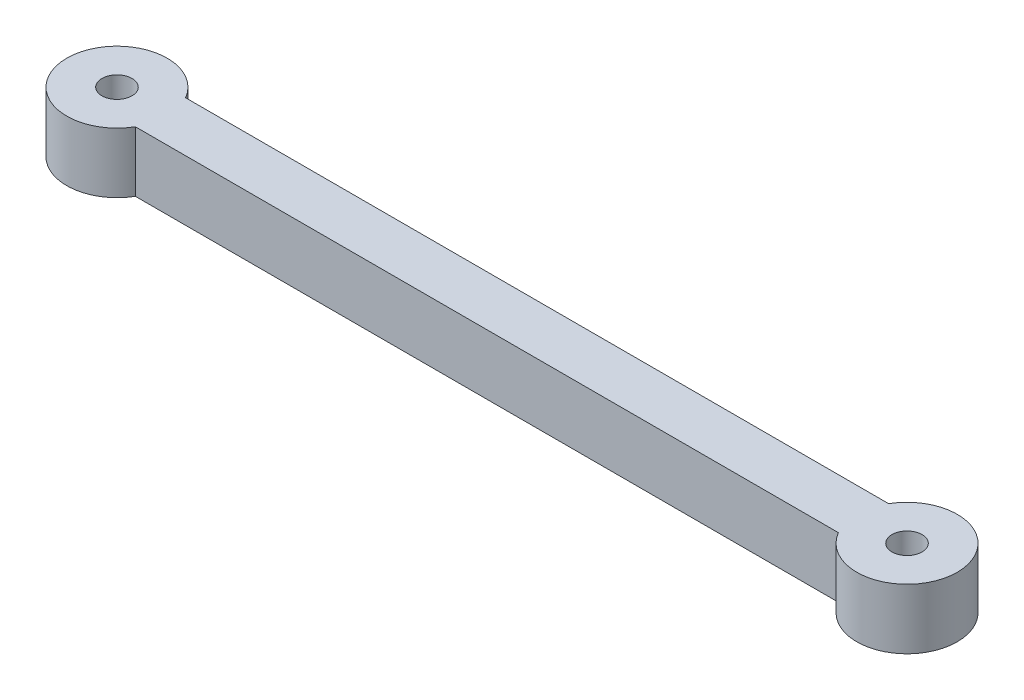
ISO-10303-21;
HEADER;
FILE_DESCRIPTION(('STEP AP214'),'2;1');
FILE_NAME('part.step','',(''),(''),'','','');
FILE_SCHEMA(('AUTOMOTIVE_DESIGN { 1 0 10303 214 1 1 1 1 }'));
ENDSEC;
DATA;
#1=APPLICATION_CONTEXT('core data for automotive mechanical design processes');
#2=APPLICATION_PROTOCOL_DEFINITION('international standard','automotive_design',2000,#1);
#3=PRODUCT_CONTEXT('',#1,'mechanical');
#4=PRODUCT('Part','Part','',(#3));
#5=PRODUCT_RELATED_PRODUCT_CATEGORY('part','',(#4));
#6=PRODUCT_DEFINITION_FORMATION('','',#4);
#7=PRODUCT_DEFINITION_CONTEXT('part definition',#1,'design');
#8=PRODUCT_DEFINITION('design','',#6,#7);
#9=PRODUCT_DEFINITION_SHAPE('','',#8);
#10=(LENGTH_UNIT() NAMED_UNIT(*) SI_UNIT(.MILLI.,.METRE.));
#11=(NAMED_UNIT(*) PLANE_ANGLE_UNIT() SI_UNIT($,.RADIAN.));
#12=(NAMED_UNIT(*) SI_UNIT($,.STERADIAN.) SOLID_ANGLE_UNIT());
#13=UNCERTAINTY_MEASURE_WITH_UNIT(LENGTH_MEASURE(1.E-05),#10,'distance_accuracy_value','');
#14=(GEOMETRIC_REPRESENTATION_CONTEXT(3) GLOBAL_UNCERTAINTY_ASSIGNED_CONTEXT((#13)) GLOBAL_UNIT_ASSIGNED_CONTEXT((#10,
#11,#12)) REPRESENTATION_CONTEXT('',''));
#15=CARTESIAN_POINT('',(0.,0.,0.));
#16=DIRECTION('',(0.,0.,1.));
#17=DIRECTION('',(1.,0.,0.));
#18=AXIS2_PLACEMENT_3D('',#15,#16,#17);
#19=CARTESIAN_POINT('',(-39.3301270189222,6.,0.));
#20=DIRECTION('',(0.,-1.,0.));
#21=DIRECTION('',(0.,0.,-1.));
#22=AXIS2_PLACEMENT_3D('',#19,#20,#21);
#23=CYLINDRICAL_SURFACE('',#22,5.);
#24=CARTESIAN_POINT('',(-39.3301270189222,0.,0.));
#25=DIRECTION('',(0.,1.,0.));
#26=DIRECTION('',(0.,0.,1.));
#27=AXIS2_PLACEMENT_3D('',#24,#25,#26);
#28=CIRCLE('',#27,5.);
#29=CARTESIAN_POINT('',(-35.,0.,-2.5));
#30=VERTEX_POINT('',#29);
#31=CARTESIAN_POINT('',(-35.,0.,2.5));
#32=VERTEX_POINT('',#31);
#33=EDGE_CURVE('E96',#30,#32,#28,.T.);
#34=ORIENTED_EDGE('',*,*,#33,.T.);
#35=DIRECTION('',(0.,-1.,0.));
#36=VECTOR('',#35,1.);
#37=CARTESIAN_POINT('',(-35.,6.,2.5));
#38=LINE('',#37,#36);
#39=CARTESIAN_POINT('',(-35.,6.,2.5));
#40=VERTEX_POINT('',#39);
#41=EDGE_CURVE('E11',#40,#32,#38,.T.);
#42=ORIENTED_EDGE('',*,*,#41,.F.);
#43=CARTESIAN_POINT('',(-39.3301270189222,6.,0.));
#44=DIRECTION('',(0.,1.,0.));
#45=DIRECTION('',(0.,0.,1.));
#46=AXIS2_PLACEMENT_3D('',#43,#44,#45);
#47=CIRCLE('',#46,5.);
#48=CARTESIAN_POINT('',(-35.,6.,-2.5));
#49=VERTEX_POINT('',#48);
#50=EDGE_CURVE('E84',#49,#40,#47,.T.);
#51=ORIENTED_EDGE('',*,*,#50,.F.);
#52=DIRECTION('',(0.,-1.,0.));
#53=VECTOR('',#52,1.);
#54=CARTESIAN_POINT('',(-35.,6.,-2.5));
#55=LINE('',#54,#53);
#56=EDGE_CURVE('E92',#49,#30,#55,.T.);
#57=ORIENTED_EDGE('',*,*,#56,.T.);
#58=EDGE_LOOP('',(#34,#42,#51,#57));
#59=FACE_BOUND('',#58,.T.);
#60=ADVANCED_FACE('F33',(#59),#23,.T.);
#61=CARTESIAN_POINT('',(-35.,6.,2.5));
#62=DIRECTION('',(0.,0.,-1.));
#63=DIRECTION('',(-1.,0.,0.));
#64=AXIS2_PLACEMENT_3D('',#61,#62,#63);
#65=PLANE('',#64);
#66=DIRECTION('',(1.,0.,0.));
#67=VECTOR('',#66,1.);
#68=CARTESIAN_POINT('',(-35.,0.,2.5));
#69=LINE('',#68,#67);
#70=CARTESIAN_POINT('',(35.,0.,2.5));
#71=VERTEX_POINT('',#70);
#72=EDGE_CURVE('E88',#32,#71,#69,.T.);
#73=ORIENTED_EDGE('',*,*,#72,.T.);
#74=DIRECTION('',(0.,-1.,0.));
#75=VECTOR('',#74,1.);
#76=CARTESIAN_POINT('',(35.,6.,2.5));
#77=LINE('',#76,#75);
#78=CARTESIAN_POINT('',(35.,6.,2.5));
#79=VERTEX_POINT('',#78);
#80=EDGE_CURVE('E41',#79,#71,#77,.T.);
#81=ORIENTED_EDGE('',*,*,#80,.F.);
#82=DIRECTION('',(1.,0.,0.));
#83=VECTOR('',#82,1.);
#84=CARTESIAN_POINT('',(-35.,6.,2.5));
#85=LINE('',#84,#83);
#86=EDGE_CURVE('E79',#40,#79,#85,.T.);
#87=ORIENTED_EDGE('',*,*,#86,.F.);
#88=ORIENTED_EDGE('',*,*,#41,.T.);
#89=EDGE_LOOP('',(#73,#81,#87,#88));
#90=FACE_BOUND('',#89,.T.);
#91=ADVANCED_FACE('F87',(#90),#65,.F.);
#92=CARTESIAN_POINT('',(39.3301270189222,6.,0.));
#93=DIRECTION('',(0.,-1.,0.));
#94=DIRECTION('',(0.,0.,-1.));
#95=AXIS2_PLACEMENT_3D('',#92,#93,#94);
#96=CYLINDRICAL_SURFACE('',#95,5.);
#97=CARTESIAN_POINT('',(39.3301270189222,0.,0.));
#98=DIRECTION('',(0.,1.,0.));
#99=DIRECTION('',(0.,0.,-1.));
#100=AXIS2_PLACEMENT_3D('',#97,#98,#99);
#101=CIRCLE('',#100,5.);
#102=CARTESIAN_POINT('',(35.,0.,-2.5));
#103=VERTEX_POINT('',#102);
#104=EDGE_CURVE('E66',#71,#103,#101,.T.);
#105=ORIENTED_EDGE('',*,*,#104,.T.);
#106=DIRECTION('',(0.,-1.,0.));
#107=VECTOR('',#106,1.);
#108=CARTESIAN_POINT('',(35.,6.,-2.5));
#109=LINE('',#108,#107);
#110=CARTESIAN_POINT('',(35.,6.,-2.5));
#111=VERTEX_POINT('',#110);
#112=EDGE_CURVE('E89',#111,#103,#109,.T.);
#113=ORIENTED_EDGE('',*,*,#112,.F.);
#114=CARTESIAN_POINT('',(39.3301270189222,6.,0.));
#115=DIRECTION('',(0.,1.,0.));
#116=DIRECTION('',(0.,0.,-1.));
#117=AXIS2_PLACEMENT_3D('',#114,#115,#116);
#118=CIRCLE('',#117,5.);
#119=EDGE_CURVE('E82',#79,#111,#118,.T.);
#120=ORIENTED_EDGE('',*,*,#119,.F.);
#121=ORIENTED_EDGE('',*,*,#80,.T.);
#122=EDGE_LOOP('',(#105,#113,#120,#121));
#123=FACE_BOUND('',#122,.T.);
#124=ADVANCED_FACE('F90',(#123),#96,.T.);
#125=CARTESIAN_POINT('',(-35.,6.,-2.5));
#126=DIRECTION('',(0.,0.,1.));
#127=DIRECTION('',(1.,0.,0.));
#128=AXIS2_PLACEMENT_3D('',#125,#126,#127);
#129=PLANE('',#128);
#130=DIRECTION('',(-1.,0.,0.));
#131=VECTOR('',#130,1.);
#132=CARTESIAN_POINT('',(-35.,0.,-2.5));
#133=LINE('',#132,#131);
#134=EDGE_CURVE('E72',#103,#30,#133,.T.);
#135=ORIENTED_EDGE('',*,*,#134,.T.);
#136=ORIENTED_EDGE('',*,*,#56,.F.);
#137=DIRECTION('',(-1.,0.,0.));
#138=VECTOR('',#137,1.);
#139=CARTESIAN_POINT('',(-35.,6.,-2.5));
#140=LINE('',#139,#138);
#141=EDGE_CURVE('E49',#111,#49,#140,.T.);
#142=ORIENTED_EDGE('',*,*,#141,.F.);
#143=ORIENTED_EDGE('',*,*,#112,.T.);
#144=EDGE_LOOP('',(#135,#136,#142,#143));
#145=FACE_BOUND('',#144,.T.);
#146=ADVANCED_FACE('F104',(#145),#129,.F.);
#147=CARTESIAN_POINT('',(-39.3301270189222,6.,0.));
#148=DIRECTION('',(0.,1.,0.));
#149=DIRECTION('',(0.,0.,1.));
#150=AXIS2_PLACEMENT_3D('',#147,#148,#149);
#151=PLANE('',#150);
#152=CARTESIAN_POINT('',(-39.3301270189222,6.,0.));
#153=DIRECTION('',(0.,1.,0.));
#154=DIRECTION('',(0.,0.,1.));
#155=AXIS2_PLACEMENT_3D('',#152,#153,#154);
#156=CIRCLE('',#155,1.5);
#157=CARTESIAN_POINT('',(-39.3301270189222,6.,1.5));
#158=VERTEX_POINT('',#157);
#159=EDGE_CURVE('E116',#158,#158,#156,.T.);
#160=ORIENTED_EDGE('',*,*,#159,.F.);
#161=EDGE_LOOP('',(#160));
#162=FACE_BOUND('',#161,.T.);
#163=CARTESIAN_POINT('',(39.3301270189222,6.,0.));
#164=DIRECTION('',(0.,1.,0.));
#165=DIRECTION('',(0.,0.,1.));
#166=AXIS2_PLACEMENT_3D('',#163,#164,#165);
#167=CIRCLE('',#166,1.5);
#168=CARTESIAN_POINT('',(39.3301270189222,6.,1.5));
#169=VERTEX_POINT('',#168);
#170=EDGE_CURVE('E110',#169,#169,#167,.T.);
#171=ORIENTED_EDGE('',*,*,#170,.F.);
#172=EDGE_LOOP('',(#171));
#173=FACE_BOUND('',#172,.T.);
#174=ORIENTED_EDGE('',*,*,#50,.T.);
#175=ORIENTED_EDGE('',*,*,#86,.T.);
#176=ORIENTED_EDGE('',*,*,#119,.T.);
#177=ORIENTED_EDGE('',*,*,#141,.T.);
#178=EDGE_LOOP('',(#174,#175,#176,#177));
#179=FACE_BOUND('',#178,.T.);
#180=ADVANCED_FACE('F80',(#162,#173,#179),#151,.T.);
#181=CARTESIAN_POINT('',(-39.3301270189222,0.,0.));
#182=DIRECTION('',(0.,1.,0.));
#183=DIRECTION('',(0.,0.,1.));
#184=AXIS2_PLACEMENT_3D('',#181,#182,#183);
#185=PLANE('',#184);
#186=CARTESIAN_POINT('',(-39.3301270189222,0.,0.));
#187=DIRECTION('',(0.,1.,0.));
#188=DIRECTION('',(0.,0.,1.));
#189=AXIS2_PLACEMENT_3D('',#186,#187,#188);
#190=CIRCLE('',#189,1.5);
#191=CARTESIAN_POINT('',(-39.3301270189222,0.,1.5));
#192=VERTEX_POINT('',#191);
#193=EDGE_CURVE('E99',#192,#192,#190,.T.);
#194=ORIENTED_EDGE('',*,*,#193,.T.);
#195=EDGE_LOOP('',(#194));
#196=FACE_BOUND('',#195,.T.);
#197=CARTESIAN_POINT('',(39.3301270189222,0.,0.));
#198=DIRECTION('',(0.,1.,0.));
#199=DIRECTION('',(0.,0.,1.));
#200=AXIS2_PLACEMENT_3D('',#197,#198,#199);
#201=CIRCLE('',#200,1.5);
#202=CARTESIAN_POINT('',(39.3301270189222,0.,1.5));
#203=VERTEX_POINT('',#202);
#204=EDGE_CURVE('E113',#203,#203,#201,.T.);
#205=ORIENTED_EDGE('',*,*,#204,.T.);
#206=EDGE_LOOP('',(#205));
#207=FACE_BOUND('',#206,.T.);
#208=ORIENTED_EDGE('',*,*,#33,.F.);
#209=ORIENTED_EDGE('',*,*,#134,.F.);
#210=ORIENTED_EDGE('',*,*,#104,.F.);
#211=ORIENTED_EDGE('',*,*,#72,.F.);
#212=EDGE_LOOP('',(#208,#209,#210,#211));
#213=FACE_BOUND('',#212,.T.);
#214=ADVANCED_FACE('F107',(#196,#207,#213),#185,.F.);
#215=CARTESIAN_POINT('',(39.3301270189222,0.,0.));
#216=DIRECTION('',(0.,1.,0.));
#217=DIRECTION('',(0.,0.,1.));
#218=AXIS2_PLACEMENT_3D('',#215,#216,#217);
#219=CYLINDRICAL_SURFACE('',#218,1.5);
#220=ORIENTED_EDGE('',*,*,#204,.F.);
#221=EDGE_LOOP('',(#220));
#222=FACE_BOUND('',#221,.T.);
#223=ORIENTED_EDGE('',*,*,#170,.T.);
#224=EDGE_LOOP('',(#223));
#225=FACE_BOUND('',#224,.T.);
#226=ADVANCED_FACE('F127',(#222,#225),#219,.F.);
#227=CARTESIAN_POINT('',(-39.3301270189222,0.,0.));
#228=DIRECTION('',(0.,1.,0.));
#229=DIRECTION('',(0.,0.,1.));
#230=AXIS2_PLACEMENT_3D('',#227,#228,#229);
#231=CYLINDRICAL_SURFACE('',#230,1.5);
#232=ORIENTED_EDGE('',*,*,#193,.F.);
#233=EDGE_LOOP('',(#232));
#234=FACE_BOUND('',#233,.T.);
#235=ORIENTED_EDGE('',*,*,#159,.T.);
#236=EDGE_LOOP('',(#235));
#237=FACE_BOUND('',#236,.T.);
#238=ADVANCED_FACE('F124',(#234,#237),#231,.F.);
#239=CLOSED_SHELL('',(#60,#91,#124,#146,#180,#214,#226,#238));
#240=MANIFOLD_SOLID_BREP('B2',#239);
#241=ADVANCED_BREP_SHAPE_REPRESENTATION('',(#18,#240),#14);
#242=SHAPE_DEFINITION_REPRESENTATION(#9,#241);
ENDSEC;
END-ISO-10303-21;
